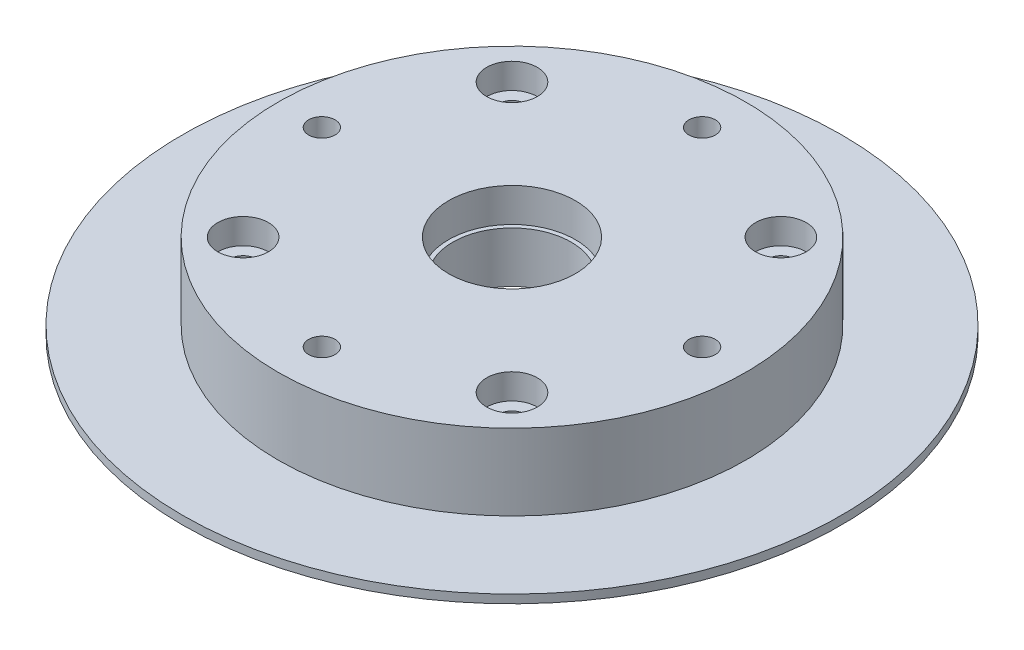
ISO-10303-21;
HEADER;
FILE_DESCRIPTION(('STEP AP214'),'2;1');
FILE_NAME('part.step','',(''),(''),'','','');
FILE_SCHEMA(('AUTOMOTIVE_DESIGN { 1 0 10303 214 1 1 1 1 }'));
ENDSEC;
DATA;
#1=APPLICATION_CONTEXT('core data for automotive mechanical design processes');
#2=APPLICATION_PROTOCOL_DEFINITION('international standard','automotive_design',2000,#1);
#3=PRODUCT_CONTEXT('',#1,'mechanical');
#4=PRODUCT('Part','Part','',(#3));
#5=PRODUCT_RELATED_PRODUCT_CATEGORY('part','',(#4));
#6=PRODUCT_DEFINITION_FORMATION('','',#4);
#7=PRODUCT_DEFINITION_CONTEXT('part definition',#1,'design');
#8=PRODUCT_DEFINITION('design','',#6,#7);
#9=PRODUCT_DEFINITION_SHAPE('','',#8);
#10=(LENGTH_UNIT() NAMED_UNIT(*) SI_UNIT(.MILLI.,.METRE.));
#11=(NAMED_UNIT(*) PLANE_ANGLE_UNIT() SI_UNIT($,.RADIAN.));
#12=(NAMED_UNIT(*) SI_UNIT($,.STERADIAN.) SOLID_ANGLE_UNIT());
#13=UNCERTAINTY_MEASURE_WITH_UNIT(LENGTH_MEASURE(1.E-05),#10,'distance_accuracy_value','');
#14=(GEOMETRIC_REPRESENTATION_CONTEXT(3) GLOBAL_UNCERTAINTY_ASSIGNED_CONTEXT((#13)) GLOBAL_UNIT_ASSIGNED_CONTEXT((#10,
#11,#12)) REPRESENTATION_CONTEXT('',''));
#15=CARTESIAN_POINT('',(0.,0.,0.));
#16=DIRECTION('',(0.,0.,1.));
#17=DIRECTION('',(1.,0.,0.));
#18=AXIS2_PLACEMENT_3D('',#15,#16,#17);
#19=CARTESIAN_POINT('',(0.,-1.,-22.5));
#20=DIRECTION('',(0.,1.,0.));
#21=DIRECTION('',(0.,0.,1.));
#22=AXIS2_PLACEMENT_3D('',#19,#20,#21);
#23=CYLINDRICAL_SURFACE('',#22,1.5635);
#24=CARTESIAN_POINT('',(0.,9.,-22.5));
#25=DIRECTION('',(0.,1.,0.));
#26=DIRECTION('',(0.,0.,1.));
#27=AXIS2_PLACEMENT_3D('',#24,#25,#26);
#28=CIRCLE('',#27,1.5635);
#29=CARTESIAN_POINT('',(0.,9.,-20.9365));
#30=VERTEX_POINT('',#29);
#31=EDGE_CURVE('E143',#30,#30,#28,.T.);
#32=ORIENTED_EDGE('',*,*,#31,.T.);
#33=EDGE_LOOP('',(#32));
#34=FACE_BOUND('',#33,.T.);
#35=CARTESIAN_POINT('',(0.,3.,-22.5));
#36=DIRECTION('',(0.,-1.,0.));
#37=DIRECTION('',(0.,0.,-1.));
#38=AXIS2_PLACEMENT_3D('',#35,#36,#37);
#39=CIRCLE('',#38,1.5635);
#40=CARTESIAN_POINT('',(0.,3.,-24.0635));
#41=VERTEX_POINT('',#40);
#42=EDGE_CURVE('E41',#41,#41,#39,.F.);
#43=ORIENTED_EDGE('',*,*,#42,.F.);
#44=EDGE_LOOP('',(#43));
#45=FACE_BOUND('',#44,.T.);
#46=ADVANCED_FACE('F37',(#34,#45),#23,.F.);
#47=CARTESIAN_POINT('',(-22.5,-1.,0.));
#48=DIRECTION('',(0.,1.,0.));
#49=DIRECTION('',(0.,0.,1.));
#50=AXIS2_PLACEMENT_3D('',#47,#48,#49);
#51=CYLINDRICAL_SURFACE('',#50,1.5635);
#52=CARTESIAN_POINT('',(-22.5,9.,0.));
#53=DIRECTION('',(0.,1.,0.));
#54=DIRECTION('',(0.,0.,1.));
#55=AXIS2_PLACEMENT_3D('',#52,#53,#54);
#56=CIRCLE('',#55,1.5635);
#57=CARTESIAN_POINT('',(-22.5,9.,1.5635));
#58=VERTEX_POINT('',#57);
#59=EDGE_CURVE('E140',#58,#58,#56,.T.);
#60=ORIENTED_EDGE('',*,*,#59,.T.);
#61=EDGE_LOOP('',(#60));
#62=FACE_BOUND('',#61,.T.);
#63=CARTESIAN_POINT('',(-22.5,3.,0.));
#64=DIRECTION('',(0.,-1.,0.));
#65=DIRECTION('',(0.,0.,-1.));
#66=AXIS2_PLACEMENT_3D('',#63,#64,#65);
#67=CIRCLE('',#66,1.5635);
#68=CARTESIAN_POINT('',(-22.5,3.,-1.56349999999999));
#69=VERTEX_POINT('',#68);
#70=EDGE_CURVE('E81',#69,#69,#67,.F.);
#71=ORIENTED_EDGE('',*,*,#70,.F.);
#72=EDGE_LOOP('',(#71));
#73=FACE_BOUND('',#72,.T.);
#74=ADVANCED_FACE('F170',(#62,#73),#51,.F.);
#75=CARTESIAN_POINT('',(0.,-1.,22.5));
#76=DIRECTION('',(0.,1.,0.));
#77=DIRECTION('',(0.,0.,1.));
#78=AXIS2_PLACEMENT_3D('',#75,#76,#77);
#79=CYLINDRICAL_SURFACE('',#78,1.5635);
#80=CARTESIAN_POINT('',(0.,9.,22.5));
#81=DIRECTION('',(0.,1.,0.));
#82=DIRECTION('',(0.,0.,1.));
#83=AXIS2_PLACEMENT_3D('',#80,#81,#82);
#84=CIRCLE('',#83,1.5635);
#85=CARTESIAN_POINT('',(0.,9.,24.0635));
#86=VERTEX_POINT('',#85);
#87=EDGE_CURVE('E137',#86,#86,#84,.T.);
#88=ORIENTED_EDGE('',*,*,#87,.T.);
#89=EDGE_LOOP('',(#88));
#90=FACE_BOUND('',#89,.T.);
#91=CARTESIAN_POINT('',(0.,3.,22.5));
#92=DIRECTION('',(0.,-1.,0.));
#93=DIRECTION('',(0.,0.,-1.));
#94=AXIS2_PLACEMENT_3D('',#91,#92,#93);
#95=CIRCLE('',#94,1.5635);
#96=CARTESIAN_POINT('',(0.,3.,20.9365));
#97=VERTEX_POINT('',#96);
#98=EDGE_CURVE('E78',#97,#97,#95,.F.);
#99=ORIENTED_EDGE('',*,*,#98,.F.);
#100=EDGE_LOOP('',(#99));
#101=FACE_BOUND('',#100,.T.);
#102=ADVANCED_FACE('F176',(#90,#101),#79,.F.);
#103=CARTESIAN_POINT('',(22.5,-1.,0.));
#104=DIRECTION('',(0.,1.,0.));
#105=DIRECTION('',(0.,0.,1.));
#106=AXIS2_PLACEMENT_3D('',#103,#104,#105);
#107=CYLINDRICAL_SURFACE('',#106,1.5635);
#108=CARTESIAN_POINT('',(22.5,9.,0.));
#109=DIRECTION('',(0.,1.,0.));
#110=DIRECTION('',(0.,0.,1.));
#111=AXIS2_PLACEMENT_3D('',#108,#109,#110);
#112=CIRCLE('',#111,1.5635);
#113=CARTESIAN_POINT('',(22.5,9.,1.5635));
#114=VERTEX_POINT('',#113);
#115=EDGE_CURVE('E73',#114,#114,#112,.T.);
#116=ORIENTED_EDGE('',*,*,#115,.T.);
#117=EDGE_LOOP('',(#116));
#118=FACE_BOUND('',#117,.T.);
#119=CARTESIAN_POINT('',(22.5,3.,0.));
#120=DIRECTION('',(0.,-1.,0.));
#121=DIRECTION('',(0.,0.,-1.));
#122=AXIS2_PLACEMENT_3D('',#119,#120,#121);
#123=CIRCLE('',#122,1.5635);
#124=CARTESIAN_POINT('',(22.5,3.,-1.5635));
#125=VERTEX_POINT('',#124);
#126=EDGE_CURVE('E75',#125,#125,#123,.F.);
#127=ORIENTED_EDGE('',*,*,#126,.F.);
#128=EDGE_LOOP('',(#127));
#129=FACE_BOUND('',#128,.T.);
#130=ADVANCED_FACE('F195',(#118,#129),#107,.F.);
#131=CARTESIAN_POINT('',(15.9099025766973,-1.,-15.9099025766973));
#132=DIRECTION('',(0.,1.,0.));
#133=DIRECTION('',(0.,0.,1.));
#134=AXIS2_PLACEMENT_3D('',#131,#132,#133);
#135=CYLINDRICAL_SURFACE('',#134,1.5635);
#136=CARTESIAN_POINT('',(15.9099025766973,-1.,-15.9099025766973));
#137=DIRECTION('',(0.,1.,0.));
#138=DIRECTION('',(0.,0.,1.));
#139=AXIS2_PLACEMENT_3D('',#136,#137,#138);
#140=CIRCLE('',#139,1.5635);
#141=CARTESIAN_POINT('',(15.9099025766973,-1.,-14.3464025766973));
#142=VERTEX_POINT('',#141);
#143=EDGE_CURVE('E45',#142,#142,#140,.T.);
#144=ORIENTED_EDGE('',*,*,#143,.F.);
#145=EDGE_LOOP('',(#144));
#146=FACE_BOUND('',#145,.T.);
#147=CARTESIAN_POINT('',(15.9099025766973,6.,-15.9099025766973));
#148=DIRECTION('',(0.,1.,0.));
#149=DIRECTION('',(0.,0.,1.));
#150=AXIS2_PLACEMENT_3D('',#147,#148,#149);
#151=CIRCLE('',#150,1.5635);
#152=CARTESIAN_POINT('',(15.9099025766973,6.,-14.3464025766973));
#153=VERTEX_POINT('',#152);
#154=EDGE_CURVE('E114',#153,#153,#151,.F.);
#155=ORIENTED_EDGE('',*,*,#154,.F.);
#156=EDGE_LOOP('',(#155));
#157=FACE_BOUND('',#156,.T.);
#158=ADVANCED_FACE('F182',(#146,#157),#135,.F.);
#159=CARTESIAN_POINT('',(-15.9099025766973,-1.,-15.9099025766973));
#160=DIRECTION('',(0.,1.,0.));
#161=DIRECTION('',(0.,0.,1.));
#162=AXIS2_PLACEMENT_3D('',#159,#160,#161);
#163=CYLINDRICAL_SURFACE('',#162,1.5635);
#164=CARTESIAN_POINT('',(-15.9099025766973,-1.,-15.9099025766973));
#165=DIRECTION('',(0.,1.,0.));
#166=DIRECTION('',(0.,0.,1.));
#167=AXIS2_PLACEMENT_3D('',#164,#165,#166);
#168=CIRCLE('',#167,1.5635);
#169=CARTESIAN_POINT('',(-15.9099025766973,-1.,-14.3464025766973));
#170=VERTEX_POINT('',#169);
#171=EDGE_CURVE('E50',#170,#170,#168,.T.);
#172=ORIENTED_EDGE('',*,*,#171,.F.);
#173=EDGE_LOOP('',(#172));
#174=FACE_BOUND('',#173,.T.);
#175=CARTESIAN_POINT('',(-15.9099025766973,6.,-15.9099025766973));
#176=DIRECTION('',(0.,1.,0.));
#177=DIRECTION('',(0.,0.,1.));
#178=AXIS2_PLACEMENT_3D('',#175,#176,#177);
#179=CIRCLE('',#178,1.5635);
#180=CARTESIAN_POINT('',(-15.9099025766973,6.,-14.3464025766973));
#181=VERTEX_POINT('',#180);
#182=EDGE_CURVE('E128',#181,#181,#179,.F.);
#183=ORIENTED_EDGE('',*,*,#182,.F.);
#184=EDGE_LOOP('',(#183));
#185=FACE_BOUND('',#184,.T.);
#186=ADVANCED_FACE('F184',(#174,#185),#163,.F.);
#187=CARTESIAN_POINT('',(-15.9099025766973,-1.,15.9099025766973));
#188=DIRECTION('',(0.,1.,0.));
#189=DIRECTION('',(0.,0.,1.));
#190=AXIS2_PLACEMENT_3D('',#187,#188,#189);
#191=CYLINDRICAL_SURFACE('',#190,1.5635);
#192=CARTESIAN_POINT('',(-15.9099025766973,-1.,15.9099025766973));
#193=DIRECTION('',(0.,1.,0.));
#194=DIRECTION('',(0.,0.,1.));
#195=AXIS2_PLACEMENT_3D('',#192,#193,#194);
#196=CIRCLE('',#195,1.5635);
#197=CARTESIAN_POINT('',(-15.9099025766973,-1.,17.4734025766973));
#198=VERTEX_POINT('',#197);
#199=EDGE_CURVE('E63',#198,#198,#196,.T.);
#200=ORIENTED_EDGE('',*,*,#199,.F.);
#201=EDGE_LOOP('',(#200));
#202=FACE_BOUND('',#201,.T.);
#203=CARTESIAN_POINT('',(-15.9099025766973,6.,15.9099025766973));
#204=DIRECTION('',(0.,1.,0.));
#205=DIRECTION('',(0.,0.,1.));
#206=AXIS2_PLACEMENT_3D('',#203,#204,#205);
#207=CIRCLE('',#206,1.5635);
#208=CARTESIAN_POINT('',(-15.9099025766973,6.,17.4734025766973));
#209=VERTEX_POINT('',#208);
#210=EDGE_CURVE('E123',#209,#209,#207,.F.);
#211=ORIENTED_EDGE('',*,*,#210,.F.);
#212=EDGE_LOOP('',(#211));
#213=FACE_BOUND('',#212,.T.);
#214=ADVANCED_FACE('F186',(#202,#213),#191,.F.);
#215=CARTESIAN_POINT('',(15.9099025766973,-1.,15.9099025766973));
#216=DIRECTION('',(0.,1.,0.));
#217=DIRECTION('',(0.,0.,1.));
#218=AXIS2_PLACEMENT_3D('',#215,#216,#217);
#219=CYLINDRICAL_SURFACE('',#218,1.5635);
#220=CARTESIAN_POINT('',(15.9099025766973,-1.,15.9099025766973));
#221=DIRECTION('',(0.,1.,0.));
#222=DIRECTION('',(0.,0.,1.));
#223=AXIS2_PLACEMENT_3D('',#220,#221,#222);
#224=CIRCLE('',#223,1.5635);
#225=CARTESIAN_POINT('',(15.9099025766973,-1.,17.4734025766973));
#226=VERTEX_POINT('',#225);
#227=EDGE_CURVE('E59',#226,#226,#224,.T.);
#228=ORIENTED_EDGE('',*,*,#227,.F.);
#229=EDGE_LOOP('',(#228));
#230=FACE_BOUND('',#229,.T.);
#231=CARTESIAN_POINT('',(15.9099025766973,6.,15.9099025766973));
#232=DIRECTION('',(0.,1.,0.));
#233=DIRECTION('',(0.,0.,1.));
#234=AXIS2_PLACEMENT_3D('',#231,#232,#233);
#235=CIRCLE('',#234,1.5635);
#236=CARTESIAN_POINT('',(15.9099025766973,6.,17.4734025766973));
#237=VERTEX_POINT('',#236);
#238=EDGE_CURVE('E70',#237,#237,#235,.F.);
#239=ORIENTED_EDGE('',*,*,#238,.F.);
#240=EDGE_LOOP('',(#239));
#241=FACE_BOUND('',#240,.T.);
#242=ADVANCED_FACE('F191',(#230,#241),#219,.F.);
#243=CARTESIAN_POINT('',(0.,-1.,0.));
#244=DIRECTION('',(0.,1.,0.));
#245=DIRECTION('',(0.,0.,1.));
#246=AXIS2_PLACEMENT_3D('',#243,#244,#245);
#247=CYLINDRICAL_SURFACE('',#246,39.);
#248=CARTESIAN_POINT('',(0.,-1.,0.));
#249=DIRECTION('',(0.,1.,0.));
#250=DIRECTION('',(0.,0.,1.));
#251=AXIS2_PLACEMENT_3D('',#248,#249,#250);
#252=CIRCLE('',#251,39.);
#253=CARTESIAN_POINT('',(0.,-1.,39.));
#254=VERTEX_POINT('',#253);
#255=EDGE_CURVE('E56',#254,#254,#252,.T.);
#256=ORIENTED_EDGE('',*,*,#255,.T.);
#257=EDGE_LOOP('',(#256));
#258=FACE_BOUND('',#257,.T.);
#259=CARTESIAN_POINT('',(0.,0.,0.));
#260=DIRECTION('',(0.,1.,0.));
#261=DIRECTION('',(0.,0.,1.));
#262=AXIS2_PLACEMENT_3D('',#259,#260,#261);
#263=CIRCLE('',#262,39.);
#264=CARTESIAN_POINT('',(0.,0.,39.));
#265=VERTEX_POINT('',#264);
#266=EDGE_CURVE('E60',#265,#265,#263,.T.);
#267=ORIENTED_EDGE('',*,*,#266,.F.);
#268=EDGE_LOOP('',(#267));
#269=FACE_BOUND('',#268,.T.);
#270=ADVANCED_FACE('F39',(#258,#269),#247,.T.);
#271=CARTESIAN_POINT('',(0.,-1.,0.));
#272=DIRECTION('',(0.,1.,0.));
#273=DIRECTION('',(0.,0.,1.));
#274=AXIS2_PLACEMENT_3D('',#271,#272,#273);
#275=CYLINDRICAL_SURFACE('',#274,7.5);
#276=CARTESIAN_POINT('',(0.,5.,0.));
#277=DIRECTION('',(0.,1.,0.));
#278=DIRECTION('',(0.,0.,1.));
#279=AXIS2_PLACEMENT_3D('',#276,#277,#278);
#280=CIRCLE('',#279,7.5);
#281=CARTESIAN_POINT('',(0.,5.,7.5));
#282=VERTEX_POINT('',#281);
#283=EDGE_CURVE('E86',#282,#282,#280,.T.);
#284=ORIENTED_EDGE('',*,*,#283,.F.);
#285=EDGE_LOOP('',(#284));
#286=FACE_BOUND('',#285,.T.);
#287=CARTESIAN_POINT('',(0.,9.,0.));
#288=DIRECTION('',(0.,1.,0.));
#289=DIRECTION('',(0.,0.,1.));
#290=AXIS2_PLACEMENT_3D('',#287,#288,#289);
#291=CIRCLE('',#290,7.5);
#292=CARTESIAN_POINT('',(0.,9.,7.5));
#293=VERTEX_POINT('',#292);
#294=EDGE_CURVE('E145',#293,#293,#291,.T.);
#295=ORIENTED_EDGE('',*,*,#294,.T.);
#296=EDGE_LOOP('',(#295));
#297=FACE_BOUND('',#296,.T.);
#298=ADVANCED_FACE('F532',(#286,#297),#275,.F.);
#299=CARTESIAN_POINT('',(0.,-1.,0.));
#300=DIRECTION('',(0.,1.,0.));
#301=DIRECTION('',(0.,0.,1.));
#302=AXIS2_PLACEMENT_3D('',#299,#300,#301);
#303=PLANE('',#302);
#304=CARTESIAN_POINT('',(22.5,-1.,0.));
#305=DIRECTION('',(0.,-1.,0.));
#306=DIRECTION('',(0.,0.,-1.));
#307=AXIS2_PLACEMENT_3D('',#304,#305,#306);
#308=CIRCLE('',#307,1.925);
#309=CARTESIAN_POINT('',(22.5,-1.,-1.925));
#310=VERTEX_POINT('',#309);
#311=EDGE_CURVE('E614',#310,#310,#308,.T.);
#312=ORIENTED_EDGE('',*,*,#311,.F.);
#313=EDGE_LOOP('',(#312));
#314=FACE_BOUND('',#313,.T.);
#315=CARTESIAN_POINT('',(0.,-1.,-22.5));
#316=DIRECTION('',(0.,-1.,0.));
#317=DIRECTION('',(0.,0.,-1.));
#318=AXIS2_PLACEMENT_3D('',#315,#316,#317);
#319=CIRCLE('',#318,1.925);
#320=CARTESIAN_POINT('',(0.,-1.,-24.425));
#321=VERTEX_POINT('',#320);
#322=EDGE_CURVE('E618',#321,#321,#319,.T.);
#323=ORIENTED_EDGE('',*,*,#322,.F.);
#324=EDGE_LOOP('',(#323));
#325=FACE_BOUND('',#324,.T.);
#326=CARTESIAN_POINT('',(-22.5,-1.,0.));
#327=DIRECTION('',(0.,-1.,0.));
#328=DIRECTION('',(0.,0.,-1.));
#329=AXIS2_PLACEMENT_3D('',#326,#327,#328);
#330=CIRCLE('',#329,1.925);
#331=CARTESIAN_POINT('',(-22.5,-1.,-1.925));
#332=VERTEX_POINT('',#331);
#333=EDGE_CURVE('E622',#332,#332,#330,.T.);
#334=ORIENTED_EDGE('',*,*,#333,.F.);
#335=EDGE_LOOP('',(#334));
#336=FACE_BOUND('',#335,.T.);
#337=CARTESIAN_POINT('',(0.,-1.,22.5));
#338=DIRECTION('',(0.,-1.,0.));
#339=DIRECTION('',(0.,0.,-1.));
#340=AXIS2_PLACEMENT_3D('',#337,#338,#339);
#341=CIRCLE('',#340,1.925);
#342=CARTESIAN_POINT('',(0.,-1.,20.575));
#343=VERTEX_POINT('',#342);
#344=EDGE_CURVE('E625',#343,#343,#341,.T.);
#345=ORIENTED_EDGE('',*,*,#344,.F.);
#346=EDGE_LOOP('',(#345));
#347=FACE_BOUND('',#346,.T.);
#348=ORIENTED_EDGE('',*,*,#255,.F.);
#349=EDGE_LOOP('',(#348));
#350=FACE_BOUND('',#349,.T.);
#351=ORIENTED_EDGE('',*,*,#227,.T.);
#352=EDGE_LOOP('',(#351));
#353=FACE_BOUND('',#352,.T.);
#354=ORIENTED_EDGE('',*,*,#199,.T.);
#355=EDGE_LOOP('',(#354));
#356=FACE_BOUND('',#355,.T.);
#357=ORIENTED_EDGE('',*,*,#171,.T.);
#358=EDGE_LOOP('',(#357));
#359=FACE_BOUND('',#358,.T.);
#360=ORIENTED_EDGE('',*,*,#143,.T.);
#361=EDGE_LOOP('',(#360));
#362=FACE_BOUND('',#361,.T.);
#363=CARTESIAN_POINT('',(0.,-1.,0.));
#364=DIRECTION('',(0.,1.,0.));
#365=DIRECTION('',(0.,0.,1.));
#366=AXIS2_PLACEMENT_3D('',#363,#364,#365);
#367=CIRCLE('',#366,7.);
#368=CARTESIAN_POINT('',(0.,-1.,7.));
#369=VERTEX_POINT('',#368);
#370=EDGE_CURVE('E95',#369,#369,#367,.T.);
#371=ORIENTED_EDGE('',*,*,#370,.T.);
#372=EDGE_LOOP('',(#371));
#373=FACE_BOUND('',#372,.T.);
#374=ADVANCED_FACE('F165',(#314,#325,#336,#347,#350,#353,#356,#359,#362,#373),#303,.F.);
#375=CARTESIAN_POINT('',(0.,0.,0.));
#376=DIRECTION('',(0.,1.,0.));
#377=DIRECTION('',(0.,0.,1.));
#378=AXIS2_PLACEMENT_3D('',#375,#376,#377);
#379=PLANE('',#378);
#380=CARTESIAN_POINT('',(0.,0.,0.));
#381=DIRECTION('',(0.,1.,0.));
#382=DIRECTION('',(0.,0.,1.));
#383=AXIS2_PLACEMENT_3D('',#380,#381,#382);
#384=CIRCLE('',#383,27.69);
#385=CARTESIAN_POINT('',(0.,0.,27.69));
#386=VERTEX_POINT('',#385);
#387=EDGE_CURVE('E10',#386,#386,#384,.T.);
#388=ORIENTED_EDGE('',*,*,#387,.F.);
#389=EDGE_LOOP('',(#388));
#390=FACE_BOUND('',#389,.T.);
#391=ORIENTED_EDGE('',*,*,#266,.T.);
#392=EDGE_LOOP('',(#391));
#393=FACE_BOUND('',#392,.T.);
#394=ADVANCED_FACE('F156',(#390,#393),#379,.T.);
#395=CARTESIAN_POINT('',(0.,9.,0.));
#396=DIRECTION('',(0.,-1.,0.));
#397=DIRECTION('',(0.,0.,-1.));
#398=AXIS2_PLACEMENT_3D('',#395,#396,#397);
#399=CYLINDRICAL_SURFACE('',#398,27.69);
#400=CARTESIAN_POINT('',(0.,9.,0.));
#401=DIRECTION('',(0.,1.,0.));
#402=DIRECTION('',(0.,0.,1.));
#403=AXIS2_PLACEMENT_3D('',#400,#401,#402);
#404=CIRCLE('',#403,27.69);
#405=CARTESIAN_POINT('',(0.,9.,27.69));
#406=VERTEX_POINT('',#405);
#407=EDGE_CURVE('E54',#406,#406,#404,.T.);
#408=ORIENTED_EDGE('',*,*,#407,.F.);
#409=EDGE_LOOP('',(#408));
#410=FACE_BOUND('',#409,.T.);
#411=ORIENTED_EDGE('',*,*,#387,.T.);
#412=EDGE_LOOP('',(#411));
#413=FACE_BOUND('',#412,.T.);
#414=ADVANCED_FACE('F154',(#410,#413),#399,.T.);
#415=CARTESIAN_POINT('',(0.,9.,0.));
#416=DIRECTION('',(0.,1.,0.));
#417=DIRECTION('',(0.,0.,1.));
#418=AXIS2_PLACEMENT_3D('',#415,#416,#417);
#419=PLANE('',#418);
#420=CARTESIAN_POINT('',(15.9099025766973,9.,-15.9099025766973));
#421=DIRECTION('',(0.,1.,0.));
#422=DIRECTION('',(0.,0.,1.));
#423=AXIS2_PLACEMENT_3D('',#420,#421,#422);
#424=CIRCLE('',#423,3.);
#425=CARTESIAN_POINT('',(15.9099025766973,9.,-12.9099025766973));
#426=VERTEX_POINT('',#425);
#427=EDGE_CURVE('E110',#426,#426,#424,.T.);
#428=ORIENTED_EDGE('',*,*,#427,.F.);
#429=EDGE_LOOP('',(#428));
#430=FACE_BOUND('',#429,.T.);
#431=CARTESIAN_POINT('',(-15.9099025766973,9.,15.9099025766973));
#432=DIRECTION('',(0.,1.,0.));
#433=DIRECTION('',(0.,0.,1.));
#434=AXIS2_PLACEMENT_3D('',#431,#432,#433);
#435=CIRCLE('',#434,3.);
#436=CARTESIAN_POINT('',(-15.9099025766973,9.,18.9099025766973));
#437=VERTEX_POINT('',#436);
#438=EDGE_CURVE('E118',#437,#437,#435,.T.);
#439=ORIENTED_EDGE('',*,*,#438,.F.);
#440=EDGE_LOOP('',(#439));
#441=FACE_BOUND('',#440,.T.);
#442=CARTESIAN_POINT('',(15.9099025766973,9.,15.9099025766973));
#443=DIRECTION('',(0.,1.,0.));
#444=DIRECTION('',(0.,0.,1.));
#445=AXIS2_PLACEMENT_3D('',#442,#443,#444);
#446=CIRCLE('',#445,3.);
#447=CARTESIAN_POINT('',(15.9099025766973,9.,18.9099025766973));
#448=VERTEX_POINT('',#447);
#449=EDGE_CURVE('E104',#448,#448,#446,.T.);
#450=ORIENTED_EDGE('',*,*,#449,.F.);
#451=EDGE_LOOP('',(#450));
#452=FACE_BOUND('',#451,.T.);
#453=CARTESIAN_POINT('',(-15.9099025766973,9.,-15.9099025766973));
#454=DIRECTION('',(0.,1.,0.));
#455=DIRECTION('',(0.,0.,1.));
#456=AXIS2_PLACEMENT_3D('',#453,#454,#455);
#457=CIRCLE('',#456,3.);
#458=CARTESIAN_POINT('',(-15.9099025766973,9.,-12.9099025766973));
#459=VERTEX_POINT('',#458);
#460=EDGE_CURVE('E113',#459,#459,#457,.T.);
#461=ORIENTED_EDGE('',*,*,#460,.F.);
#462=EDGE_LOOP('',(#461));
#463=FACE_BOUND('',#462,.T.);
#464=ORIENTED_EDGE('',*,*,#115,.F.);
#465=EDGE_LOOP('',(#464));
#466=FACE_BOUND('',#465,.T.);
#467=ORIENTED_EDGE('',*,*,#87,.F.);
#468=EDGE_LOOP('',(#467));
#469=FACE_BOUND('',#468,.T.);
#470=ORIENTED_EDGE('',*,*,#59,.F.);
#471=EDGE_LOOP('',(#470));
#472=FACE_BOUND('',#471,.T.);
#473=ORIENTED_EDGE('',*,*,#31,.F.);
#474=EDGE_LOOP('',(#473));
#475=FACE_BOUND('',#474,.T.);
#476=ORIENTED_EDGE('',*,*,#294,.F.);
#477=EDGE_LOOP('',(#476));
#478=FACE_BOUND('',#477,.T.);
#479=ORIENTED_EDGE('',*,*,#407,.T.);
#480=EDGE_LOOP('',(#479));
#481=FACE_BOUND('',#480,.T.);
#482=ADVANCED_FACE('F152',(#430,#441,#452,#463,#466,#469,#472,#475,#478,#481),#419,.T.);
#483=CARTESIAN_POINT('',(-15.9099025766973,6.,-15.9099025766973));
#484=DIRECTION('',(0.,1.,0.));
#485=DIRECTION('',(0.,0.,1.));
#486=AXIS2_PLACEMENT_3D('',#483,#484,#485);
#487=CYLINDRICAL_SURFACE('',#486,3.);
#488=CARTESIAN_POINT('',(-15.9099025766973,6.,-15.9099025766973));
#489=DIRECTION('',(0.,1.,0.));
#490=DIRECTION('',(0.,0.,1.));
#491=AXIS2_PLACEMENT_3D('',#488,#489,#490);
#492=CIRCLE('',#491,3.);
#493=CARTESIAN_POINT('',(-15.9099025766973,6.,-12.9099025766973));
#494=VERTEX_POINT('',#493);
#495=EDGE_CURVE('E74',#494,#494,#492,.T.);
#496=ORIENTED_EDGE('',*,*,#495,.F.);
#497=EDGE_LOOP('',(#496));
#498=FACE_BOUND('',#497,.T.);
#499=ORIENTED_EDGE('',*,*,#460,.T.);
#500=EDGE_LOOP('',(#499));
#501=FACE_BOUND('',#500,.T.);
#502=ADVANCED_FACE('F162',(#498,#501),#487,.F.);
#503=CARTESIAN_POINT('',(0.,6.,0.));
#504=DIRECTION('',(0.,1.,0.));
#505=DIRECTION('',(0.,0.,1.));
#506=AXIS2_PLACEMENT_3D('',#503,#504,#505);
#507=PLANE('',#506);
#508=ORIENTED_EDGE('',*,*,#182,.T.);
#509=EDGE_LOOP('',(#508));
#510=FACE_BOUND('',#509,.T.);
#511=ORIENTED_EDGE('',*,*,#495,.T.);
#512=EDGE_LOOP('',(#511));
#513=FACE_BOUND('',#512,.T.);
#514=ADVANCED_FACE('F261',(#510,#513),#507,.T.);
#515=CARTESIAN_POINT('',(15.9099025766973,6.,15.9099025766973));
#516=DIRECTION('',(0.,1.,0.));
#517=DIRECTION('',(0.,0.,1.));
#518=AXIS2_PLACEMENT_3D('',#515,#516,#517);
#519=PLANE('',#518);
#520=CARTESIAN_POINT('',(15.9099025766973,6.,15.9099025766973));
#521=DIRECTION('',(0.,1.,0.));
#522=DIRECTION('',(0.,0.,1.));
#523=AXIS2_PLACEMENT_3D('',#520,#521,#522);
#524=CIRCLE('',#523,3.);
#525=CARTESIAN_POINT('',(15.9099025766973,6.,18.9099025766973));
#526=VERTEX_POINT('',#525);
#527=EDGE_CURVE('E103',#526,#526,#524,.T.);
#528=ORIENTED_EDGE('',*,*,#527,.T.);
#529=EDGE_LOOP('',(#528));
#530=FACE_BOUND('',#529,.T.);
#531=ORIENTED_EDGE('',*,*,#238,.T.);
#532=EDGE_LOOP('',(#531));
#533=FACE_BOUND('',#532,.T.);
#534=ADVANCED_FACE('F257',(#530,#533),#519,.T.);
#535=CARTESIAN_POINT('',(15.9099025766973,6.,15.9099025766973));
#536=DIRECTION('',(0.,1.,0.));
#537=DIRECTION('',(0.,0.,1.));
#538=AXIS2_PLACEMENT_3D('',#535,#536,#537);
#539=CYLINDRICAL_SURFACE('',#538,3.);
#540=ORIENTED_EDGE('',*,*,#527,.F.);
#541=EDGE_LOOP('',(#540));
#542=FACE_BOUND('',#541,.T.);
#543=ORIENTED_EDGE('',*,*,#449,.T.);
#544=EDGE_LOOP('',(#543));
#545=FACE_BOUND('',#544,.T.);
#546=ADVANCED_FACE('F253',(#542,#545),#539,.F.);
#547=CARTESIAN_POINT('',(-15.9099025766973,6.,15.9099025766973));
#548=DIRECTION('',(0.,1.,0.));
#549=DIRECTION('',(0.,0.,1.));
#550=AXIS2_PLACEMENT_3D('',#547,#548,#549);
#551=CYLINDRICAL_SURFACE('',#550,3.);
#552=CARTESIAN_POINT('',(-15.9099025766973,6.,15.9099025766973));
#553=DIRECTION('',(0.,1.,0.));
#554=DIRECTION('',(0.,0.,1.));
#555=AXIS2_PLACEMENT_3D('',#552,#553,#554);
#556=CIRCLE('',#555,3.);
#557=CARTESIAN_POINT('',(-15.9099025766973,6.,18.9099025766973));
#558=VERTEX_POINT('',#557);
#559=EDGE_CURVE('E107',#558,#558,#556,.T.);
#560=ORIENTED_EDGE('',*,*,#559,.F.);
#561=EDGE_LOOP('',(#560));
#562=FACE_BOUND('',#561,.T.);
#563=ORIENTED_EDGE('',*,*,#438,.T.);
#564=EDGE_LOOP('',(#563));
#565=FACE_BOUND('',#564,.T.);
#566=ADVANCED_FACE('F256',(#562,#565),#551,.F.);
#567=CARTESIAN_POINT('',(0.,6.,0.));
#568=DIRECTION('',(0.,1.,0.));
#569=DIRECTION('',(0.,0.,1.));
#570=AXIS2_PLACEMENT_3D('',#567,#568,#569);
#571=PLANE('',#570);
#572=ORIENTED_EDGE('',*,*,#210,.T.);
#573=EDGE_LOOP('',(#572));
#574=FACE_BOUND('',#573,.T.);
#575=ORIENTED_EDGE('',*,*,#559,.T.);
#576=EDGE_LOOP('',(#575));
#577=FACE_BOUND('',#576,.T.);
#578=ADVANCED_FACE('F266',(#574,#577),#571,.T.);
#579=CARTESIAN_POINT('',(15.9099025766973,6.,-15.9099025766973));
#580=DIRECTION('',(0.,1.,0.));
#581=DIRECTION('',(0.,0.,1.));
#582=AXIS2_PLACEMENT_3D('',#579,#580,#581);
#583=CYLINDRICAL_SURFACE('',#582,3.);
#584=CARTESIAN_POINT('',(15.9099025766973,6.,-15.9099025766973));
#585=DIRECTION('',(0.,1.,0.));
#586=DIRECTION('',(0.,0.,1.));
#587=AXIS2_PLACEMENT_3D('',#584,#585,#586);
#588=CIRCLE('',#587,3.);
#589=CARTESIAN_POINT('',(15.9099025766973,6.,-12.9099025766973));
#590=VERTEX_POINT('',#589);
#591=EDGE_CURVE('E115',#590,#590,#588,.T.);
#592=ORIENTED_EDGE('',*,*,#591,.F.);
#593=EDGE_LOOP('',(#592));
#594=FACE_BOUND('',#593,.T.);
#595=ORIENTED_EDGE('',*,*,#427,.T.);
#596=EDGE_LOOP('',(#595));
#597=FACE_BOUND('',#596,.T.);
#598=ADVANCED_FACE('F263',(#594,#597),#583,.F.);
#599=CARTESIAN_POINT('',(0.,6.,0.));
#600=DIRECTION('',(0.,1.,0.));
#601=DIRECTION('',(0.,0.,1.));
#602=AXIS2_PLACEMENT_3D('',#599,#600,#601);
#603=PLANE('',#602);
#604=ORIENTED_EDGE('',*,*,#154,.T.);
#605=EDGE_LOOP('',(#604));
#606=FACE_BOUND('',#605,.T.);
#607=ORIENTED_EDGE('',*,*,#591,.T.);
#608=EDGE_LOOP('',(#607));
#609=FACE_BOUND('',#608,.T.);
#610=ADVANCED_FACE('F251',(#606,#609),#603,.T.);
#611=CARTESIAN_POINT('',(0.,-1.,0.));
#612=DIRECTION('',(0.,1.,0.));
#613=DIRECTION('',(0.,0.,1.));
#614=AXIS2_PLACEMENT_3D('',#611,#612,#613);
#615=CYLINDRICAL_SURFACE('',#614,7.);
#616=ORIENTED_EDGE('',*,*,#370,.F.);
#617=EDGE_LOOP('',(#616));
#618=FACE_BOUND('',#617,.T.);
#619=CARTESIAN_POINT('',(0.,5.,0.));
#620=DIRECTION('',(0.,1.,0.));
#621=DIRECTION('',(0.,0.,1.));
#622=AXIS2_PLACEMENT_3D('',#619,#620,#621);
#623=CIRCLE('',#622,7.);
#624=CARTESIAN_POINT('',(0.,5.,7.));
#625=VERTEX_POINT('',#624);
#626=EDGE_CURVE('E90',#625,#625,#623,.T.);
#627=ORIENTED_EDGE('',*,*,#626,.T.);
#628=EDGE_LOOP('',(#627));
#629=FACE_BOUND('',#628,.T.);
#630=ADVANCED_FACE('F248',(#618,#629),#615,.F.);
#631=CARTESIAN_POINT('',(0.,5.,0.));
#632=DIRECTION('',(0.,1.,0.));
#633=DIRECTION('',(0.,0.,1.));
#634=AXIS2_PLACEMENT_3D('',#631,#632,#633);
#635=PLANE('',#634);
#636=ORIENTED_EDGE('',*,*,#283,.T.);
#637=EDGE_LOOP('',(#636));
#638=FACE_BOUND('',#637,.T.);
#639=ORIENTED_EDGE('',*,*,#626,.F.);
#640=EDGE_LOOP('',(#639));
#641=FACE_BOUND('',#640,.T.);
#642=ADVANCED_FACE('F244',(#638,#641),#635,.T.);
#643=CARTESIAN_POINT('',(0.,3.,22.5));
#644=DIRECTION('',(0.,-1.,0.));
#645=DIRECTION('',(0.,0.,-1.));
#646=AXIS2_PLACEMENT_3D('',#643,#644,#645);
#647=PLANE('',#646);
#648=CARTESIAN_POINT('',(0.,3.,22.5));
#649=DIRECTION('',(0.,-1.,0.));
#650=DIRECTION('',(0.,0.,-1.));
#651=AXIS2_PLACEMENT_3D('',#648,#649,#650);
#652=CIRCLE('',#651,1.925);
#653=CARTESIAN_POINT('',(0.,3.,20.575));
#654=VERTEX_POINT('',#653);
#655=EDGE_CURVE('E98',#654,#654,#652,.T.);
#656=ORIENTED_EDGE('',*,*,#655,.T.);
#657=EDGE_LOOP('',(#656));
#658=FACE_BOUND('',#657,.T.);
#659=ORIENTED_EDGE('',*,*,#98,.T.);
#660=EDGE_LOOP('',(#659));
#661=FACE_BOUND('',#660,.T.);
#662=ADVANCED_FACE('F240',(#658,#661),#647,.T.);
#663=CARTESIAN_POINT('',(0.,3.,22.5));
#664=DIRECTION('',(0.,-1.,0.));
#665=DIRECTION('',(0.,0.,-1.));
#666=AXIS2_PLACEMENT_3D('',#663,#664,#665);
#667=CYLINDRICAL_SURFACE('',#666,1.925);
#668=ORIENTED_EDGE('',*,*,#655,.F.);
#669=EDGE_LOOP('',(#668));
#670=FACE_BOUND('',#669,.T.);
#671=ORIENTED_EDGE('',*,*,#344,.T.);
#672=EDGE_LOOP('',(#671));
#673=FACE_BOUND('',#672,.T.);
#674=ADVANCED_FACE('F236',(#670,#673),#667,.F.);
#675=CARTESIAN_POINT('',(-22.5,3.,0.));
#676=DIRECTION('',(0.,-1.,0.));
#677=DIRECTION('',(0.,0.,-1.));
#678=AXIS2_PLACEMENT_3D('',#675,#676,#677);
#679=PLANE('',#678);
#680=CARTESIAN_POINT('',(-22.5,3.,0.));
#681=DIRECTION('',(0.,-1.,0.));
#682=DIRECTION('',(0.,0.,-1.));
#683=AXIS2_PLACEMENT_3D('',#680,#681,#682);
#684=CIRCLE('',#683,1.925);
#685=CARTESIAN_POINT('',(-22.5,3.,-1.925));
#686=VERTEX_POINT('',#685);
#687=EDGE_CURVE('E627',#686,#686,#684,.T.);
#688=ORIENTED_EDGE('',*,*,#687,.T.);
#689=EDGE_LOOP('',(#688));
#690=FACE_BOUND('',#689,.T.);
#691=ORIENTED_EDGE('',*,*,#70,.T.);
#692=EDGE_LOOP('',(#691));
#693=FACE_BOUND('',#692,.T.);
#694=ADVANCED_FACE('F232',(#690,#693),#679,.T.);
#695=CARTESIAN_POINT('',(-22.5,3.,0.));
#696=DIRECTION('',(0.,-1.,0.));
#697=DIRECTION('',(0.,0.,-1.));
#698=AXIS2_PLACEMENT_3D('',#695,#696,#697);
#699=CYLINDRICAL_SURFACE('',#698,1.925);
#700=ORIENTED_EDGE('',*,*,#687,.F.);
#701=EDGE_LOOP('',(#700));
#702=FACE_BOUND('',#701,.T.);
#703=ORIENTED_EDGE('',*,*,#333,.T.);
#704=EDGE_LOOP('',(#703));
#705=FACE_BOUND('',#704,.T.);
#706=ADVANCED_FACE('F228',(#702,#705),#699,.F.);
#707=CARTESIAN_POINT('',(0.,3.,-22.5));
#708=DIRECTION('',(0.,-1.,0.));
#709=DIRECTION('',(0.,0.,-1.));
#710=AXIS2_PLACEMENT_3D('',#707,#708,#709);
#711=PLANE('',#710);
#712=CARTESIAN_POINT('',(0.,3.,-22.5));
#713=DIRECTION('',(0.,-1.,0.));
#714=DIRECTION('',(0.,0.,-1.));
#715=AXIS2_PLACEMENT_3D('',#712,#713,#714);
#716=CIRCLE('',#715,1.925);
#717=CARTESIAN_POINT('',(0.,3.,-24.425));
#718=VERTEX_POINT('',#717);
#719=EDGE_CURVE('E633',#718,#718,#716,.T.);
#720=ORIENTED_EDGE('',*,*,#719,.T.);
#721=EDGE_LOOP('',(#720));
#722=FACE_BOUND('',#721,.T.);
#723=ORIENTED_EDGE('',*,*,#42,.T.);
#724=EDGE_LOOP('',(#723));
#725=FACE_BOUND('',#724,.T.);
#726=ADVANCED_FACE('F221',(#722,#725),#711,.T.);
#727=CARTESIAN_POINT('',(0.,3.,-22.5));
#728=DIRECTION('',(0.,-1.,0.));
#729=DIRECTION('',(0.,0.,-1.));
#730=AXIS2_PLACEMENT_3D('',#727,#728,#729);
#731=CYLINDRICAL_SURFACE('',#730,1.925);
#732=ORIENTED_EDGE('',*,*,#719,.F.);
#733=EDGE_LOOP('',(#732));
#734=FACE_BOUND('',#733,.T.);
#735=ORIENTED_EDGE('',*,*,#322,.T.);
#736=EDGE_LOOP('',(#735));
#737=FACE_BOUND('',#736,.T.);
#738=ADVANCED_FACE('F212',(#734,#737),#731,.F.);
#739=CARTESIAN_POINT('',(22.5,3.,0.));
#740=DIRECTION('',(0.,-1.,0.));
#741=DIRECTION('',(0.,0.,-1.));
#742=AXIS2_PLACEMENT_3D('',#739,#740,#741);
#743=PLANE('',#742);
#744=CARTESIAN_POINT('',(22.5,3.,0.));
#745=DIRECTION('',(0.,-1.,0.));
#746=DIRECTION('',(0.,0.,-1.));
#747=AXIS2_PLACEMENT_3D('',#744,#745,#746);
#748=CIRCLE('',#747,1.925);
#749=CARTESIAN_POINT('',(22.5,3.,-1.925));
#750=VERTEX_POINT('',#749);
#751=EDGE_CURVE('E79',#750,#750,#748,.T.);
#752=ORIENTED_EDGE('',*,*,#751,.T.);
#753=EDGE_LOOP('',(#752));
#754=FACE_BOUND('',#753,.T.);
#755=ORIENTED_EDGE('',*,*,#126,.T.);
#756=EDGE_LOOP('',(#755));
#757=FACE_BOUND('',#756,.T.);
#758=ADVANCED_FACE('F209',(#754,#757),#743,.T.);
#759=CARTESIAN_POINT('',(22.5,3.,0.));
#760=DIRECTION('',(0.,-1.,0.));
#761=DIRECTION('',(0.,0.,-1.));
#762=AXIS2_PLACEMENT_3D('',#759,#760,#761);
#763=CYLINDRICAL_SURFACE('',#762,1.925);
#764=ORIENTED_EDGE('',*,*,#751,.F.);
#765=EDGE_LOOP('',(#764));
#766=FACE_BOUND('',#765,.T.);
#767=ORIENTED_EDGE('',*,*,#311,.T.);
#768=EDGE_LOOP('',(#767));
#769=FACE_BOUND('',#768,.T.);
#770=ADVANCED_FACE('F211',(#766,#769),#763,.F.);
#771=CLOSED_SHELL('',(#46,#74,#102,#130,#158,#186,#214,#242,#270,#298,#374,#394,#414,#482,#502,
#514,#534,#546,#566,#578,#598,#610,#630,#642,#662,#674,#694,#706,#726,#738,#758,#770));
#772=MANIFOLD_SOLID_BREP('B2',#771);
#773=ADVANCED_BREP_SHAPE_REPRESENTATION('',(#18,#772),#14);
#774=SHAPE_DEFINITION_REPRESENTATION(#9,#773);
ENDSEC;
END-ISO-10303-21;
